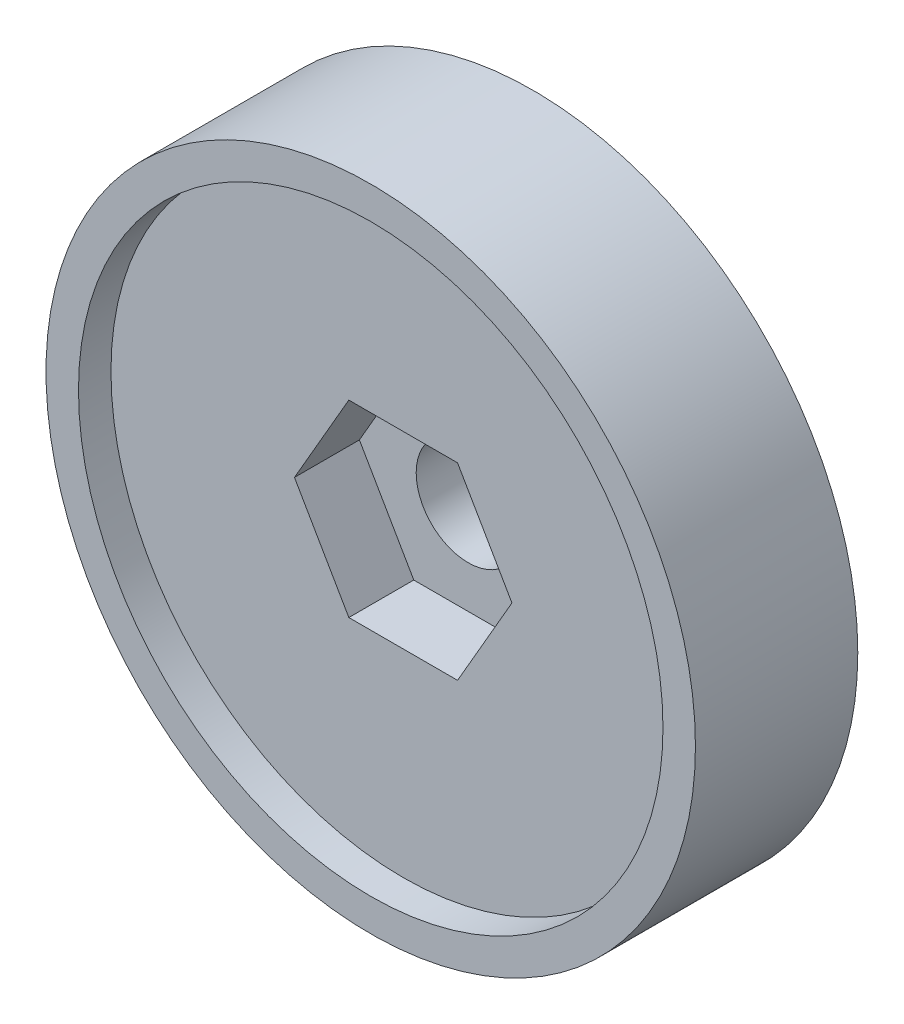
ISO-10303-21;
HEADER;
FILE_DESCRIPTION(('STEP AP214'),'2;1');
FILE_NAME('part.step','',(''),(''),'','','');
FILE_SCHEMA(('AUTOMOTIVE_DESIGN { 1 0 10303 214 1 1 1 1 }'));
ENDSEC;
DATA;
#1=APPLICATION_CONTEXT('core data for automotive mechanical design processes');
#2=APPLICATION_PROTOCOL_DEFINITION('international standard','automotive_design',2000,#1);
#3=PRODUCT_CONTEXT('',#1,'mechanical');
#4=PRODUCT('Part','Part','',(#3));
#5=PRODUCT_RELATED_PRODUCT_CATEGORY('part','',(#4));
#6=PRODUCT_DEFINITION_FORMATION('','',#4);
#7=PRODUCT_DEFINITION_CONTEXT('part definition',#1,'design');
#8=PRODUCT_DEFINITION('design','',#6,#7);
#9=PRODUCT_DEFINITION_SHAPE('','',#8);
#10=(LENGTH_UNIT() NAMED_UNIT(*) SI_UNIT(.MILLI.,.METRE.));
#11=(NAMED_UNIT(*) PLANE_ANGLE_UNIT() SI_UNIT($,.RADIAN.));
#12=(NAMED_UNIT(*) SI_UNIT($,.STERADIAN.) SOLID_ANGLE_UNIT());
#13=UNCERTAINTY_MEASURE_WITH_UNIT(LENGTH_MEASURE(1.E-05),#10,'distance_accuracy_value','');
#14=(GEOMETRIC_REPRESENTATION_CONTEXT(3) GLOBAL_UNCERTAINTY_ASSIGNED_CONTEXT((#13)) GLOBAL_UNIT_ASSIGNED_CONTEXT((#10,
#11,#12)) REPRESENTATION_CONTEXT('',''));
#15=CARTESIAN_POINT('',(0.,0.,0.));
#16=DIRECTION('',(0.,0.,1.));
#17=DIRECTION('',(1.,0.,0.));
#18=AXIS2_PLACEMENT_3D('',#15,#16,#17);
#19=CARTESIAN_POINT('',(-86.6743158471793,82.8999999999999,-8.85964634358131));
#20=DIRECTION('',(-0.866025403784439,0.5,0.));
#21=DIRECTION('',(-0.5,-0.866025403784439,0.));
#22=AXIS2_PLACEMENT_3D('',#19,#20,#21);
#23=PLANE('',#22);
#24=DIRECTION('',(0.5,0.866025403784439,0.));
#25=VECTOR('',#24,1.);
#26=CARTESIAN_POINT('',(-86.6743158471793,82.8999999999999,4.));
#27=LINE('',#26,#25);
#28=CARTESIAN_POINT('',(-88.3486316278292,79.9999999999999,4.));
#29=VERTEX_POINT('',#28);
#30=CARTESIAN_POINT('',(-86.6743158471793,82.8999999999999,4.));
#31=VERTEX_POINT('',#30);
#32=EDGE_CURVE('E102',#29,#31,#27,.T.);
#33=ORIENTED_EDGE('',*,*,#32,.F.);
#34=DIRECTION('',(0.,0.,1.));
#35=VECTOR('',#34,1.);
#36=CARTESIAN_POINT('',(-88.3486316278292,79.9999999999999,-8.85964634358131));
#37=LINE('',#36,#35);
#38=CARTESIAN_POINT('',(-88.3486316278292,79.9999999999999,2.));
#39=VERTEX_POINT('',#38);
#40=EDGE_CURVE('E105',#39,#29,#37,.T.);
#41=ORIENTED_EDGE('',*,*,#40,.F.);
#42=DIRECTION('',(0.5,0.866025403784439,0.));
#43=VECTOR('',#42,1.);
#44=CARTESIAN_POINT('',(-86.6743158471793,82.8999999999999,2.));
#45=LINE('',#44,#43);
#46=CARTESIAN_POINT('',(-86.6743158471793,82.8999999999999,2.));
#47=VERTEX_POINT('',#46);
#48=EDGE_CURVE('E74',#39,#47,#45,.T.);
#49=ORIENTED_EDGE('',*,*,#48,.T.);
#50=DIRECTION('',(0.,0.,1.));
#51=VECTOR('',#50,1.);
#52=CARTESIAN_POINT('',(-86.6743158471793,82.8999999999999,-8.85964634358131));
#53=LINE('',#52,#51);
#54=EDGE_CURVE('E107',#47,#31,#53,.T.);
#55=ORIENTED_EDGE('',*,*,#54,.T.);
#56=EDGE_LOOP('',(#33,#41,#49,#55));
#57=FACE_BOUND('',#56,.T.);
#58=ADVANCED_FACE('F38',(#57),#23,.F.);
#59=CARTESIAN_POINT('',(-83.3256842858794,82.8999999999999,-8.85964634358131));
#60=DIRECTION('',(0.,1.,0.));
#61=DIRECTION('',(0.,0.,1.));
#62=AXIS2_PLACEMENT_3D('',#59,#60,#61);
#63=PLANE('',#62);
#64=DIRECTION('',(1.,0.,0.));
#65=VECTOR('',#64,1.);
#66=CARTESIAN_POINT('',(-83.3256842858794,82.8999999999999,4.));
#67=LINE('',#66,#65);
#68=CARTESIAN_POINT('',(-83.3256842858794,82.8999999999999,4.));
#69=VERTEX_POINT('',#68);
#70=EDGE_CURVE('E108',#31,#69,#67,.T.);
#71=ORIENTED_EDGE('',*,*,#70,.F.);
#72=ORIENTED_EDGE('',*,*,#54,.F.);
#73=DIRECTION('',(1.,0.,0.));
#74=VECTOR('',#73,1.);
#75=CARTESIAN_POINT('',(-83.3256842858794,82.8999999999999,2.));
#76=LINE('',#75,#74);
#77=CARTESIAN_POINT('',(-83.3256842858794,82.8999999999999,2.));
#78=VERTEX_POINT('',#77);
#79=EDGE_CURVE('E194',#47,#78,#76,.T.);
#80=ORIENTED_EDGE('',*,*,#79,.T.);
#81=DIRECTION('',(0.,0.,1.));
#82=VECTOR('',#81,1.);
#83=CARTESIAN_POINT('',(-83.3256842858794,82.8999999999999,-8.85964634358131));
#84=LINE('',#83,#82);
#85=EDGE_CURVE('E198',#78,#69,#84,.T.);
#86=ORIENTED_EDGE('',*,*,#85,.T.);
#87=EDGE_LOOP('',(#71,#72,#80,#86));
#88=FACE_BOUND('',#87,.T.);
#89=ADVANCED_FACE('F146',(#88),#63,.F.);
#90=CARTESIAN_POINT('',(-81.6513685052295,79.9999999999999,-8.85964634358131));
#91=DIRECTION('',(0.866025403784438,0.500000000000002,0.));
#92=DIRECTION('',(-0.500000000000002,0.866025403784438,0.));
#93=AXIS2_PLACEMENT_3D('',#90,#91,#92);
#94=PLANE('',#93);
#95=DIRECTION('',(0.500000000000002,-0.866025403784438,0.));
#96=VECTOR('',#95,1.);
#97=CARTESIAN_POINT('',(-81.6513685052295,79.9999999999999,4.));
#98=LINE('',#97,#96);
#99=CARTESIAN_POINT('',(-81.6513685052295,79.9999999999999,4.));
#100=VERTEX_POINT('',#99);
#101=EDGE_CURVE('E186',#69,#100,#98,.T.);
#102=ORIENTED_EDGE('',*,*,#101,.F.);
#103=ORIENTED_EDGE('',*,*,#85,.F.);
#104=DIRECTION('',(0.500000000000002,-0.866025403784438,0.));
#105=VECTOR('',#104,1.);
#106=CARTESIAN_POINT('',(-81.6513685052295,79.9999999999999,2.));
#107=LINE('',#106,#105);
#108=CARTESIAN_POINT('',(-81.6513685052295,79.9999999999999,2.));
#109=VERTEX_POINT('',#108);
#110=EDGE_CURVE('E192',#78,#109,#107,.T.);
#111=ORIENTED_EDGE('',*,*,#110,.T.);
#112=DIRECTION('',(0.,0.,1.));
#113=VECTOR('',#112,1.);
#114=CARTESIAN_POINT('',(-81.6513685052295,79.9999999999999,-8.85964634358131));
#115=LINE('',#114,#113);
#116=EDGE_CURVE('E201',#109,#100,#115,.T.);
#117=ORIENTED_EDGE('',*,*,#116,.T.);
#118=EDGE_LOOP('',(#102,#103,#111,#117));
#119=FACE_BOUND('',#118,.T.);
#120=ADVANCED_FACE('F150',(#119),#94,.F.);
#121=CARTESIAN_POINT('',(-83.3256842858794,77.0999999999999,-8.85964634358131));
#122=DIRECTION('',(0.866025403784438,-0.500000000000001,0.));
#123=DIRECTION('',(0.500000000000001,0.866025403784438,0.));
#124=AXIS2_PLACEMENT_3D('',#121,#122,#123);
#125=PLANE('',#124);
#126=DIRECTION('',(-0.500000000000001,-0.866025403784438,0.));
#127=VECTOR('',#126,1.);
#128=CARTESIAN_POINT('',(-83.3256842858794,77.0999999999999,4.));
#129=LINE('',#128,#127);
#130=CARTESIAN_POINT('',(-83.3256842858794,77.0999999999999,4.));
#131=VERTEX_POINT('',#130);
#132=EDGE_CURVE('E180',#100,#131,#129,.T.);
#133=ORIENTED_EDGE('',*,*,#132,.F.);
#134=ORIENTED_EDGE('',*,*,#116,.F.);
#135=DIRECTION('',(-0.500000000000001,-0.866025403784438,0.));
#136=VECTOR('',#135,1.);
#137=CARTESIAN_POINT('',(-83.3256842858794,77.0999999999999,2.));
#138=LINE('',#137,#136);
#139=CARTESIAN_POINT('',(-83.3256842858794,77.0999999999999,2.));
#140=VERTEX_POINT('',#139);
#141=EDGE_CURVE('E61',#109,#140,#138,.T.);
#142=ORIENTED_EDGE('',*,*,#141,.T.);
#143=DIRECTION('',(0.,0.,1.));
#144=VECTOR('',#143,1.);
#145=CARTESIAN_POINT('',(-83.3256842858794,77.0999999999999,-8.85964634358131));
#146=LINE('',#145,#144);
#147=EDGE_CURVE('E113',#140,#131,#146,.T.);
#148=ORIENTED_EDGE('',*,*,#147,.T.);
#149=EDGE_LOOP('',(#133,#134,#142,#148));
#150=FACE_BOUND('',#149,.T.);
#151=ADVANCED_FACE('F156',(#150),#125,.F.);
#152=CARTESIAN_POINT('',(-86.6743158471793,77.0999999999999,-8.85964634358131));
#153=DIRECTION('',(0.,-1.,0.));
#154=DIRECTION('',(0.,0.,-1.));
#155=AXIS2_PLACEMENT_3D('',#152,#153,#154);
#156=PLANE('',#155);
#157=DIRECTION('',(-1.,0.,0.));
#158=VECTOR('',#157,1.);
#159=CARTESIAN_POINT('',(-86.6743158471793,77.0999999999999,4.));
#160=LINE('',#159,#158);
#161=CARTESIAN_POINT('',(-86.6743158471793,77.0999999999999,4.));
#162=VERTEX_POINT('',#161);
#163=EDGE_CURVE('E52',#131,#162,#160,.T.);
#164=ORIENTED_EDGE('',*,*,#163,.F.);
#165=ORIENTED_EDGE('',*,*,#147,.F.);
#166=DIRECTION('',(-1.,0.,0.));
#167=VECTOR('',#166,1.);
#168=CARTESIAN_POINT('',(-86.6743158471793,77.0999999999999,2.));
#169=LINE('',#168,#167);
#170=CARTESIAN_POINT('',(-86.6743158471793,77.0999999999999,2.));
#171=VERTEX_POINT('',#170);
#172=EDGE_CURVE('E189',#140,#171,#169,.T.);
#173=ORIENTED_EDGE('',*,*,#172,.T.);
#174=DIRECTION('',(0.,0.,1.));
#175=VECTOR('',#174,1.);
#176=CARTESIAN_POINT('',(-86.6743158471793,77.0999999999999,-8.85964634358131));
#177=LINE('',#176,#175);
#178=EDGE_CURVE('E111',#171,#162,#177,.T.);
#179=ORIENTED_EDGE('',*,*,#178,.T.);
#180=EDGE_LOOP('',(#164,#165,#173,#179));
#181=FACE_BOUND('',#180,.T.);
#182=ADVANCED_FACE('F141',(#181),#156,.F.);
#183=CARTESIAN_POINT('',(-88.3486316278292,79.9999999999999,-8.85964634358131));
#184=DIRECTION('',(-0.866025403784439,-0.5,0.));
#185=DIRECTION('',(0.5,-0.866025403784439,0.));
#186=AXIS2_PLACEMENT_3D('',#183,#184,#185);
#187=PLANE('',#186);
#188=DIRECTION('',(-0.5,0.866025403784439,0.));
#189=VECTOR('',#188,1.);
#190=CARTESIAN_POINT('',(-88.3486316278292,79.9999999999999,4.));
#191=LINE('',#190,#189);
#192=EDGE_CURVE('E12',#162,#29,#191,.T.);
#193=ORIENTED_EDGE('',*,*,#192,.F.);
#194=ORIENTED_EDGE('',*,*,#178,.F.);
#195=DIRECTION('',(-0.5,0.866025403784439,0.));
#196=VECTOR('',#195,1.);
#197=CARTESIAN_POINT('',(-88.3486316278292,79.9999999999999,2.));
#198=LINE('',#197,#196);
#199=EDGE_CURVE('E84',#171,#39,#198,.T.);
#200=ORIENTED_EDGE('',*,*,#199,.T.);
#201=ORIENTED_EDGE('',*,*,#40,.T.);
#202=EDGE_LOOP('',(#193,#194,#200,#201));
#203=FACE_BOUND('',#202,.T.);
#204=ADVANCED_FACE('F110',(#203),#187,.F.);
#205=CARTESIAN_POINT('',(-85.0000000665293,79.9999999999999,5.));
#206=DIRECTION('',(0.,0.,-1.));
#207=DIRECTION('',(-1.,0.,0.));
#208=AXIS2_PLACEMENT_3D('',#205,#206,#207);
#209=CYLINDRICAL_SURFACE('',#208,1.60000000000001);
#210=CARTESIAN_POINT('',(-85.0000000665293,79.9999999999999,0.));
#211=DIRECTION('',(0.,0.,-1.));
#212=DIRECTION('',(-1.,0.,0.));
#213=AXIS2_PLACEMENT_3D('',#210,#211,#212);
#214=CIRCLE('',#213,1.60000000000001);
#215=CARTESIAN_POINT('',(-86.6000000665293,79.9999999999999,0.));
#216=VERTEX_POINT('',#215);
#217=EDGE_CURVE('E119',#216,#216,#214,.T.);
#218=ORIENTED_EDGE('',*,*,#217,.T.);
#219=EDGE_LOOP('',(#218));
#220=FACE_BOUND('',#219,.T.);
#221=CARTESIAN_POINT('',(-85.0000000665293,79.9999999999999,2.));
#222=DIRECTION('',(0.,0.,1.));
#223=DIRECTION('',(1.,0.,0.));
#224=AXIS2_PLACEMENT_3D('',#221,#222,#223);
#225=CIRCLE('',#224,1.60000000000001);
#226=CARTESIAN_POINT('',(-83.4000000665293,79.9999999999999,2.));
#227=VERTEX_POINT('',#226);
#228=EDGE_CURVE('E118',#227,#227,#225,.F.);
#229=ORIENTED_EDGE('',*,*,#228,.F.);
#230=EDGE_LOOP('',(#229));
#231=FACE_BOUND('',#230,.T.);
#232=ADVANCED_FACE('F131',(#220,#231),#209,.F.);
#233=CARTESIAN_POINT('',(-85.0000000665293,79.9999999999999,0.));
#234=DIRECTION('',(0.,0.,1.));
#235=DIRECTION('',(1.,0.,0.));
#236=AXIS2_PLACEMENT_3D('',#233,#234,#235);
#237=PLANE('',#236);
#238=ORIENTED_EDGE('',*,*,#217,.F.);
#239=EDGE_LOOP('',(#238));
#240=FACE_BOUND('',#239,.T.);
#241=CARTESIAN_POINT('',(-85.0000000665293,79.9999999999999,0.));
#242=DIRECTION('',(0.,0.,1.));
#243=DIRECTION('',(1.,0.,0.));
#244=AXIS2_PLACEMENT_3D('',#241,#242,#243);
#245=CIRCLE('',#244,9.99999999999999);
#246=CARTESIAN_POINT('',(-75.0000000665294,79.9999999999999,0.));
#247=VERTEX_POINT('',#246);
#248=EDGE_CURVE('E46',#247,#247,#245,.T.);
#249=ORIENTED_EDGE('',*,*,#248,.F.);
#250=EDGE_LOOP('',(#249));
#251=FACE_BOUND('',#250,.T.);
#252=ADVANCED_FACE('F133',(#240,#251),#237,.F.);
#253=CARTESIAN_POINT('',(-85.0000000665293,79.9999999999999,2.));
#254=DIRECTION('',(0.,0.,-1.));
#255=DIRECTION('',(-1.,0.,0.));
#256=AXIS2_PLACEMENT_3D('',#253,#254,#255);
#257=CYLINDRICAL_SURFACE('',#256,9.99999999999999);
#258=ORIENTED_EDGE('',*,*,#248,.T.);
#259=EDGE_LOOP('',(#258));
#260=FACE_BOUND('',#259,.T.);
#261=CARTESIAN_POINT('',(-85.0000000665293,79.9999999999999,5.));
#262=DIRECTION('',(0.,0.,1.));
#263=DIRECTION('',(1.,0.,0.));
#264=AXIS2_PLACEMENT_3D('',#261,#262,#263);
#265=CIRCLE('',#264,9.99999999999999);
#266=CARTESIAN_POINT('',(-75.0000000665294,79.9999999999999,5.));
#267=VERTEX_POINT('',#266);
#268=EDGE_CURVE('E122',#267,#267,#265,.T.);
#269=ORIENTED_EDGE('',*,*,#268,.F.);
#270=EDGE_LOOP('',(#269));
#271=FACE_BOUND('',#270,.T.);
#272=ADVANCED_FACE('F40',(#260,#271),#257,.T.);
#273=CARTESIAN_POINT('',(0.,0.,5.));
#274=DIRECTION('',(0.,0.,1.));
#275=DIRECTION('',(1.,0.,0.));
#276=AXIS2_PLACEMENT_3D('',#273,#274,#275);
#277=PLANE('',#276);
#278=CARTESIAN_POINT('',(-85.0000000665293,79.9999999999999,5.));
#279=DIRECTION('',(0.,0.,1.));
#280=DIRECTION('',(1.,0.,0.));
#281=AXIS2_PLACEMENT_3D('',#278,#279,#280);
#282=CIRCLE('',#281,8.99999999999999);
#283=CARTESIAN_POINT('',(-76.0000000665294,79.9999999999999,5.));
#284=VERTEX_POINT('',#283);
#285=EDGE_CURVE('E178',#284,#284,#282,.T.);
#286=ORIENTED_EDGE('',*,*,#285,.F.);
#287=EDGE_LOOP('',(#286));
#288=FACE_BOUND('',#287,.T.);
#289=ORIENTED_EDGE('',*,*,#268,.T.);
#290=EDGE_LOOP('',(#289));
#291=FACE_BOUND('',#290,.T.);
#292=ADVANCED_FACE('F165',(#288,#291),#277,.T.);
#293=CARTESIAN_POINT('',(-85.0000000665293,79.9999999999999,2.));
#294=DIRECTION('',(0.,0.,1.));
#295=DIRECTION('',(1.,0.,0.));
#296=AXIS2_PLACEMENT_3D('',#293,#294,#295);
#297=PLANE('',#296);
#298=ORIENTED_EDGE('',*,*,#48,.F.);
#299=ORIENTED_EDGE('',*,*,#199,.F.);
#300=ORIENTED_EDGE('',*,*,#172,.F.);
#301=ORIENTED_EDGE('',*,*,#141,.F.);
#302=ORIENTED_EDGE('',*,*,#110,.F.);
#303=ORIENTED_EDGE('',*,*,#79,.F.);
#304=EDGE_LOOP('',(#298,#299,#300,#301,#302,#303));
#305=FACE_BOUND('',#304,.T.);
#306=ORIENTED_EDGE('',*,*,#228,.T.);
#307=EDGE_LOOP('',(#306));
#308=FACE_BOUND('',#307,.T.);
#309=ADVANCED_FACE('F129',(#305,#308),#297,.T.);
#310=CARTESIAN_POINT('',(-85.0000000665293,79.9999999999999,4.));
#311=DIRECTION('',(0.,0.,1.));
#312=DIRECTION('',(1.,0.,0.));
#313=AXIS2_PLACEMENT_3D('',#310,#311,#312);
#314=PLANE('',#313);
#315=CARTESIAN_POINT('',(-85.0000000665293,79.9999999999999,4.));
#316=DIRECTION('',(0.,0.,1.));
#317=DIRECTION('',(1.,0.,0.));
#318=AXIS2_PLACEMENT_3D('',#315,#316,#317);
#319=CIRCLE('',#318,8.99999999999999);
#320=CARTESIAN_POINT('',(-76.0000000665294,79.9999999999999,4.));
#321=VERTEX_POINT('',#320);
#322=EDGE_CURVE('E177',#321,#321,#319,.T.);
#323=ORIENTED_EDGE('',*,*,#322,.T.);
#324=EDGE_LOOP('',(#323));
#325=FACE_BOUND('',#324,.T.);
#326=ORIENTED_EDGE('',*,*,#32,.T.);
#327=ORIENTED_EDGE('',*,*,#70,.T.);
#328=ORIENTED_EDGE('',*,*,#101,.T.);
#329=ORIENTED_EDGE('',*,*,#132,.T.);
#330=ORIENTED_EDGE('',*,*,#163,.T.);
#331=ORIENTED_EDGE('',*,*,#192,.T.);
#332=EDGE_LOOP('',(#326,#327,#328,#329,#330,#331));
#333=FACE_BOUND('',#332,.T.);
#334=ADVANCED_FACE('F101',(#325,#333),#314,.T.);
#335=CARTESIAN_POINT('',(-85.0000000665293,79.9999999999999,4.));
#336=DIRECTION('',(0.,0.,1.));
#337=DIRECTION('',(1.,0.,0.));
#338=AXIS2_PLACEMENT_3D('',#335,#336,#337);
#339=CYLINDRICAL_SURFACE('',#338,8.99999999999999);
#340=ORIENTED_EDGE('',*,*,#322,.F.);
#341=EDGE_LOOP('',(#340));
#342=FACE_BOUND('',#341,.T.);
#343=ORIENTED_EDGE('',*,*,#285,.T.);
#344=EDGE_LOOP('',(#343));
#345=FACE_BOUND('',#344,.T.);
#346=ADVANCED_FACE('F167',(#342,#345),#339,.F.);
#347=CLOSED_SHELL('',(#58,#89,#120,#151,#182,#204,#232,#252,#272,#292,#309,#334,#346));
#348=MANIFOLD_SOLID_BREP('B2',#347);
#349=ADVANCED_BREP_SHAPE_REPRESENTATION('',(#18,#348),#14);
#350=SHAPE_DEFINITION_REPRESENTATION(#9,#349);
ENDSEC;
END-ISO-10303-21;
